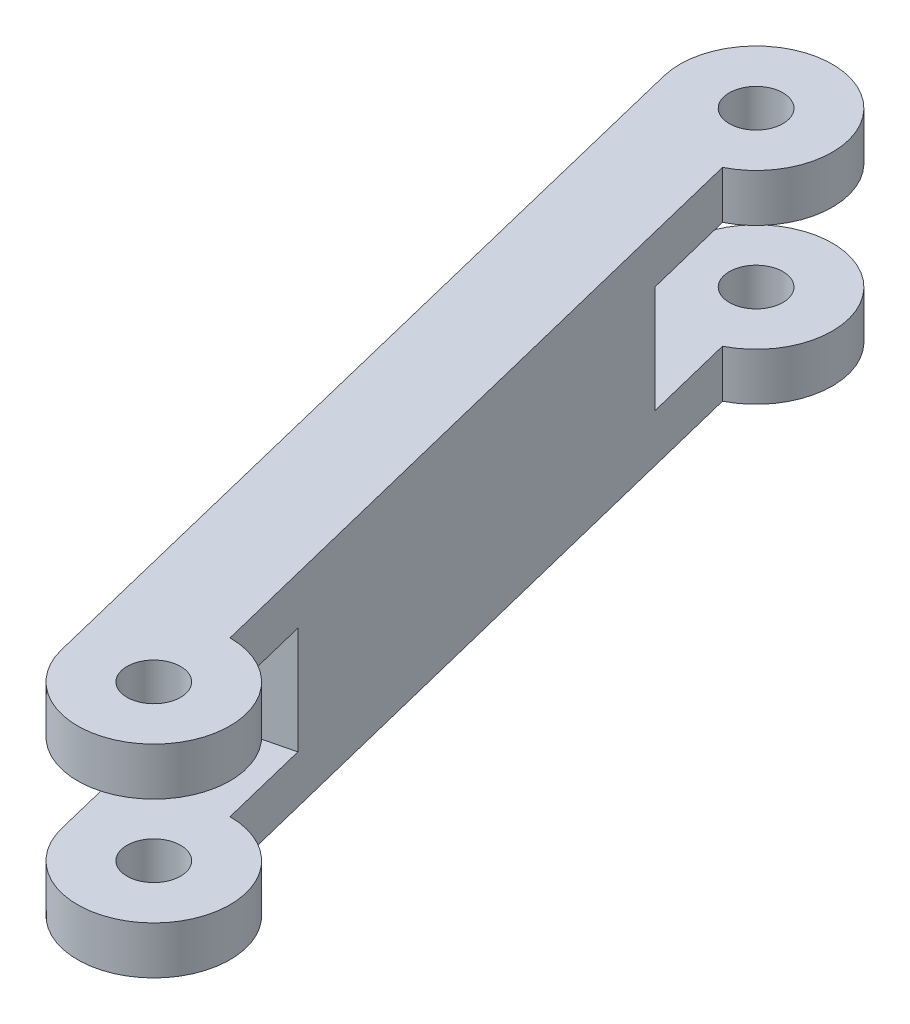
ISO-10303-21;
HEADER;
FILE_DESCRIPTION(('STEP AP214'),'2;1');
FILE_NAME('part.step','',(''),(''),'','','');
FILE_SCHEMA(('AUTOMOTIVE_DESIGN { 1 0 10303 214 1 1 1 1 }'));
ENDSEC;
DATA;
#1=APPLICATION_CONTEXT('core data for automotive mechanical design processes');
#2=APPLICATION_PROTOCOL_DEFINITION('international standard','automotive_design',2000,#1);
#3=PRODUCT_CONTEXT('',#1,'mechanical');
#4=PRODUCT('Part','Part','',(#3));
#5=PRODUCT_RELATED_PRODUCT_CATEGORY('part','',(#4));
#6=PRODUCT_DEFINITION_FORMATION('','',#4);
#7=PRODUCT_DEFINITION_CONTEXT('part definition',#1,'design');
#8=PRODUCT_DEFINITION('design','',#6,#7);
#9=PRODUCT_DEFINITION_SHAPE('','',#8);
#10=(LENGTH_UNIT() NAMED_UNIT(*) SI_UNIT(.MILLI.,.METRE.));
#11=(NAMED_UNIT(*) PLANE_ANGLE_UNIT() SI_UNIT($,.RADIAN.));
#12=(NAMED_UNIT(*) SI_UNIT($,.STERADIAN.) SOLID_ANGLE_UNIT());
#13=UNCERTAINTY_MEASURE_WITH_UNIT(LENGTH_MEASURE(1.E-05),#10,'distance_accuracy_value','');
#14=(GEOMETRIC_REPRESENTATION_CONTEXT(3) GLOBAL_UNCERTAINTY_ASSIGNED_CONTEXT((#13)) GLOBAL_UNIT_ASSIGNED_CONTEXT((#10,
#11,#12)) REPRESENTATION_CONTEXT('',''));
#15=CARTESIAN_POINT('',(0.,0.,0.));
#16=DIRECTION('',(0.,0.,1.));
#17=DIRECTION('',(1.,0.,0.));
#18=AXIS2_PLACEMENT_3D('',#15,#16,#17);
#19=CARTESIAN_POINT('',(-0.372682187268065,8.5,-3.2824835297537));
#20=DIRECTION('',(0.,-1.,0.));
#21=DIRECTION('',(0.,0.,-1.));
#22=AXIS2_PLACEMENT_3D('',#19,#20,#21);
#23=CYLINDRICAL_SURFACE('',#22,3.2);
#24=DIRECTION('',(0.,-1.,0.));
#25=VECTOR('',#24,1.);
#26=CARTESIAN_POINT('',(-3.4806210389002,8.5,-2.52043622510949));
#27=LINE('',#26,#25);
#28=CARTESIAN_POINT('',(-3.4806210389002,8.5,-2.52043622510949));
#29=VERTEX_POINT('',#28);
#30=CARTESIAN_POINT('',(-3.4806210389002,6.5,-2.52043622510948));
#31=VERTEX_POINT('',#30);
#32=EDGE_CURVE('E218',#29,#31,#27,.T.);
#33=ORIENTED_EDGE('',*,*,#32,.T.);
#34=CARTESIAN_POINT('',(-0.372682187268065,6.5,-3.2824835297537));
#35=DIRECTION('',(0.,1.,0.));
#36=DIRECTION('',(0.,0.,1.));
#37=AXIS2_PLACEMENT_3D('',#34,#35,#36);
#38=CIRCLE('',#37,3.2);
#39=CARTESIAN_POINT('',(-0.372682187268065,6.5,-6.4824835297537));
#40=VERTEX_POINT('',#39);
#41=EDGE_CURVE('E152',#31,#40,#38,.T.);
#42=ORIENTED_EDGE('',*,*,#41,.T.);
#43=DIRECTION('',(0.,-1.,0.));
#44=VECTOR('',#43,1.);
#45=CARTESIAN_POINT('',(-0.372682187268064,8.5,-6.4824835297537));
#46=LINE('',#45,#44);
#47=CARTESIAN_POINT('',(-0.372682187268064,8.5,-6.4824835297537));
#48=VERTEX_POINT('',#47);
#49=EDGE_CURVE('E215',#48,#40,#46,.T.);
#50=ORIENTED_EDGE('',*,*,#49,.F.);
#51=CARTESIAN_POINT('',(-0.372682187268065,8.5,-3.2824835297537));
#52=DIRECTION('',(0.,1.,0.));
#53=DIRECTION('',(0.,0.,1.));
#54=AXIS2_PLACEMENT_3D('',#51,#52,#53);
#55=CIRCLE('',#54,3.2);
#56=EDGE_CURVE('E197',#29,#48,#55,.T.);
#57=ORIENTED_EDGE('',*,*,#56,.F.);
#58=EDGE_LOOP('',(#33,#42,#50,#57));
#59=FACE_BOUND('',#58,.T.);
#60=ADVANCED_FACE('F32',(#59),#23,.T.);
#61=CARTESIAN_POINT('',(-0.372682187268065,8.5,-3.2824835297537));
#62=DIRECTION('',(0.,-1.,0.));
#63=DIRECTION('',(0.,0.,-1.));
#64=AXIS2_PLACEMENT_3D('',#61,#62,#63);
#65=CYLINDRICAL_SURFACE('',#64,1.125);
#66=CARTESIAN_POINT('',(-0.372682187268065,6.5,-3.2824835297537));
#67=DIRECTION('',(0.,1.,0.));
#68=DIRECTION('',(0.,0.,1.));
#69=AXIS2_PLACEMENT_3D('',#66,#67,#68);
#70=CIRCLE('',#69,1.125);
#71=CARTESIAN_POINT('',(-0.372682187268065,6.5,-2.1574835297537));
#72=VERTEX_POINT('',#71);
#73=EDGE_CURVE('E148',#72,#72,#70,.T.);
#74=ORIENTED_EDGE('',*,*,#73,.F.);
#75=EDGE_LOOP('',(#74));
#76=FACE_BOUND('',#75,.T.);
#77=CARTESIAN_POINT('',(-0.372682187268065,8.5,-3.2824835297537));
#78=DIRECTION('',(0.,1.,0.));
#79=DIRECTION('',(0.,0.,1.));
#80=AXIS2_PLACEMENT_3D('',#77,#78,#79);
#81=CIRCLE('',#80,1.125);
#82=CARTESIAN_POINT('',(-0.372682187268065,8.5,-2.1574835297537));
#83=VERTEX_POINT('',#82);
#84=EDGE_CURVE('E179',#83,#83,#81,.T.);
#85=ORIENTED_EDGE('',*,*,#84,.T.);
#86=EDGE_LOOP('',(#85));
#87=FACE_BOUND('',#86,.T.);
#88=ADVANCED_FACE('F238',(#76,#87),#65,.F.);
#89=CARTESIAN_POINT('',(-8.58443722829567,8.5,-36.7733605088558));
#90=DIRECTION('',(0.,-1.,0.));
#91=DIRECTION('',(0.,0.,-1.));
#92=AXIS2_PLACEMENT_3D('',#89,#90,#91);
#93=CYLINDRICAL_SURFACE('',#92,3.2);
#94=DIRECTION('',(0.,-1.,0.));
#95=VECTOR('',#94,1.);
#96=CARTESIAN_POINT('',(-11.6923760799278,8.5,-36.0113132042116));
#97=LINE('',#96,#95);
#98=CARTESIAN_POINT('',(-11.6923760799278,2.,-36.0113132042116));
#99=VERTEX_POINT('',#98);
#100=CARTESIAN_POINT('',(-11.6923760799278,0.,-36.0113132042116));
#101=VERTEX_POINT('',#100);
#102=EDGE_CURVE('E221',#99,#101,#97,.T.);
#103=ORIENTED_EDGE('',*,*,#102,.F.);
#104=CARTESIAN_POINT('',(-8.58443722829567,2.,-36.7733605088558));
#105=DIRECTION('',(0.,-1.,0.));
#106=DIRECTION('',(0.,0.,-1.));
#107=AXIS2_PLACEMENT_3D('',#104,#105,#106);
#108=CIRCLE('',#107,3.2);
#109=CARTESIAN_POINT('',(-7.14020433681748,2.,-33.9178060346472));
#110=VERTEX_POINT('',#109);
#111=EDGE_CURVE('E175',#99,#110,#108,.T.);
#112=ORIENTED_EDGE('',*,*,#111,.T.);
#113=DIRECTION('',(0.,-1.,0.));
#114=VECTOR('',#113,1.);
#115=CARTESIAN_POINT('',(-7.14020433681748,8.5,-33.9178060346472));
#116=LINE('',#115,#114);
#117=CARTESIAN_POINT('',(-7.14020433681748,0.,-33.9178060346472));
#118=VERTEX_POINT('',#117);
#119=EDGE_CURVE('E201',#110,#118,#116,.T.);
#120=ORIENTED_EDGE('',*,*,#119,.T.);
#121=CARTESIAN_POINT('',(-8.58443722829567,0.,-36.7733605088558));
#122=DIRECTION('',(0.,1.,0.));
#123=DIRECTION('',(0.,0.,1.));
#124=AXIS2_PLACEMENT_3D('',#121,#122,#123);
#125=CIRCLE('',#124,3.2);
#126=EDGE_CURVE('E188',#118,#101,#125,.T.);
#127=ORIENTED_EDGE('',*,*,#126,.T.);
#128=EDGE_LOOP('',(#103,#112,#120,#127));
#129=FACE_BOUND('',#128,.T.);
#130=ADVANCED_FACE('F241',(#129),#93,.T.);
#131=CARTESIAN_POINT('',(-8.58443722829567,8.5,-36.7733605088558));
#132=DIRECTION('',(0.,-1.,0.));
#133=DIRECTION('',(0.,0.,-1.));
#134=AXIS2_PLACEMENT_3D('',#131,#132,#133);
#135=CYLINDRICAL_SURFACE('',#134,1.125);
#136=CARTESIAN_POINT('',(-8.58443722829567,2.,-36.7733605088558));
#137=DIRECTION('',(0.,-1.,0.));
#138=DIRECTION('',(0.,0.,-1.));
#139=AXIS2_PLACEMENT_3D('',#136,#137,#138);
#140=CIRCLE('',#139,1.125);
#141=CARTESIAN_POINT('',(-8.58443722829567,2.,-37.8983605088558));
#142=VERTEX_POINT('',#141);
#143=EDGE_CURVE('E171',#142,#142,#140,.T.);
#144=ORIENTED_EDGE('',*,*,#143,.F.);
#145=EDGE_LOOP('',(#144));
#146=FACE_BOUND('',#145,.T.);
#147=CARTESIAN_POINT('',(-8.58443722829567,0.,-36.7733605088558));
#148=DIRECTION('',(0.,1.,0.));
#149=DIRECTION('',(0.,0.,1.));
#150=AXIS2_PLACEMENT_3D('',#147,#148,#149);
#151=CIRCLE('',#150,1.125);
#152=CARTESIAN_POINT('',(-8.58443722829567,0.,-35.6483605088558));
#153=VERTEX_POINT('',#152);
#154=EDGE_CURVE('E182',#153,#153,#151,.T.);
#155=ORIENTED_EDGE('',*,*,#154,.F.);
#156=EDGE_LOOP('',(#155));
#157=FACE_BOUND('',#156,.T.);
#158=ADVANCED_FACE('F249',(#146,#157),#135,.F.);
#159=CARTESIAN_POINT('',(-8.58443722829567,8.5,-36.7733605088558));
#160=DIRECTION('',(0.,1.,0.));
#161=DIRECTION('',(0.,0.,1.));
#162=AXIS2_PLACEMENT_3D('',#159,#160,#161);
#163=PLANE('',#162);
#164=CARTESIAN_POINT('',(-8.58443722829567,8.5,-36.7733605088558));
#165=DIRECTION('',(0.,1.,0.));
#166=DIRECTION('',(0.,0.,1.));
#167=AXIS2_PLACEMENT_3D('',#164,#165,#166);
#168=CIRCLE('',#167,1.125);
#169=CARTESIAN_POINT('',(-8.58443722829567,8.5,-35.6483605088558));
#170=VERTEX_POINT('',#169);
#171=EDGE_CURVE('E185',#170,#170,#168,.T.);
#172=ORIENTED_EDGE('',*,*,#171,.F.);
#173=EDGE_LOOP('',(#172));
#174=FACE_BOUND('',#173,.T.);
#175=CARTESIAN_POINT('',(-8.58443722829567,8.5,-36.7733605088558));
#176=DIRECTION('',(0.,1.,0.));
#177=DIRECTION('',(0.,0.,1.));
#178=AXIS2_PLACEMENT_3D('',#175,#176,#177);
#179=CIRCLE('',#178,3.2);
#180=CARTESIAN_POINT('',(-7.14020433681748,8.5,-33.9178060346472));
#181=VERTEX_POINT('',#180);
#182=CARTESIAN_POINT('',(-11.6923760799278,8.5,-36.0113132042116));
#183=VERTEX_POINT('',#182);
#184=EDGE_CURVE('E191',#181,#183,#179,.T.);
#185=ORIENTED_EDGE('',*,*,#184,.T.);
#186=DIRECTION('',(0.238139782701317,0.,0.971230891135043));
#187=VECTOR('',#186,1.);
#188=CARTESIAN_POINT('',(-11.6923760799278,8.5,-36.0113132042116));
#189=LINE('',#188,#187);
#190=EDGE_CURVE('E194',#183,#29,#189,.T.);
#191=ORIENTED_EDGE('',*,*,#190,.T.);
#192=ORIENTED_EDGE('',*,*,#56,.T.);
#193=DIRECTION('',(-0.239493228230933,0.,-0.970898034621312));
#194=VECTOR('',#193,1.);
#195=CARTESIAN_POINT('',(-7.14020433681748,8.5,-33.9178060346472));
#196=LINE('',#195,#194);
#197=EDGE_CURVE('E199',#48,#181,#196,.T.);
#198=ORIENTED_EDGE('',*,*,#197,.T.);
#199=EDGE_LOOP('',(#185,#191,#192,#198));
#200=FACE_BOUND('',#199,.T.);
#201=ORIENTED_EDGE('',*,*,#84,.F.);
#202=EDGE_LOOP('',(#201));
#203=FACE_BOUND('',#202,.T.);
#204=ADVANCED_FACE('F246',(#174,#200,#203),#163,.T.);
#205=CARTESIAN_POINT('',(-8.58443722829567,0.,-36.7733605088558));
#206=DIRECTION('',(0.,1.,0.));
#207=DIRECTION('',(0.,0.,1.));
#208=AXIS2_PLACEMENT_3D('',#205,#206,#207);
#209=PLANE('',#208);
#210=ORIENTED_EDGE('',*,*,#126,.F.);
#211=DIRECTION('',(-0.239493228230933,0.,-0.970898034621312));
#212=VECTOR('',#211,1.);
#213=CARTESIAN_POINT('',(-7.14020433681748,0.,-33.9178060346472));
#214=LINE('',#213,#212);
#215=CARTESIAN_POINT('',(-0.372682187268064,0.,-6.4824835297537));
#216=VERTEX_POINT('',#215);
#217=EDGE_CURVE('E195',#216,#118,#214,.T.);
#218=ORIENTED_EDGE('',*,*,#217,.F.);
#219=CARTESIAN_POINT('',(-0.372682187268065,0.,-3.2824835297537));
#220=DIRECTION('',(0.,1.,0.));
#221=DIRECTION('',(0.,0.,1.));
#222=AXIS2_PLACEMENT_3D('',#219,#220,#221);
#223=CIRCLE('',#222,3.2);
#224=CARTESIAN_POINT('',(-3.4806210389002,0.,-2.52043622510949));
#225=VERTEX_POINT('',#224);
#226=EDGE_CURVE('E206',#225,#216,#223,.T.);
#227=ORIENTED_EDGE('',*,*,#226,.F.);
#228=DIRECTION('',(0.238139782701317,0.,0.971230891135043));
#229=VECTOR('',#228,1.);
#230=CARTESIAN_POINT('',(-11.6923760799278,0.,-36.0113132042116));
#231=LINE('',#230,#229);
#232=EDGE_CURVE('E204',#101,#225,#231,.T.);
#233=ORIENTED_EDGE('',*,*,#232,.F.);
#234=EDGE_LOOP('',(#210,#218,#227,#233));
#235=FACE_BOUND('',#234,.T.);
#236=ORIENTED_EDGE('',*,*,#154,.T.);
#237=EDGE_LOOP('',(#236));
#238=FACE_BOUND('',#237,.T.);
#239=CARTESIAN_POINT('',(-0.372682187268065,0.,-3.2824835297537));
#240=DIRECTION('',(0.,1.,0.));
#241=DIRECTION('',(0.,0.,1.));
#242=AXIS2_PLACEMENT_3D('',#239,#240,#241);
#243=CIRCLE('',#242,1.125);
#244=CARTESIAN_POINT('',(-0.372682187268065,0.,-2.1574835297537));
#245=VERTEX_POINT('',#244);
#246=EDGE_CURVE('E178',#245,#245,#243,.T.);
#247=ORIENTED_EDGE('',*,*,#246,.T.);
#248=EDGE_LOOP('',(#247));
#249=FACE_BOUND('',#248,.T.);
#250=ADVANCED_FACE('F248',(#235,#238,#249),#209,.F.);
#251=CARTESIAN_POINT('',(-7.14020433681748,6.5,-33.9178060346472));
#252=VERTEX_POINT('',#251);
#253=EDGE_CURVE('E211',#181,#252,#116,.T.);
#254=ORIENTED_EDGE('',*,*,#253,.T.);
#255=CARTESIAN_POINT('',(-8.58443722829567,6.5,-36.7733605088558));
#256=DIRECTION('',(0.,1.,0.));
#257=DIRECTION('',(0.,0.,1.));
#258=AXIS2_PLACEMENT_3D('',#255,#256,#257);
#259=CIRCLE('',#258,3.2);
#260=CARTESIAN_POINT('',(-11.6923760799278,6.5,-36.0113132042116));
#261=VERTEX_POINT('',#260);
#262=EDGE_CURVE('E55',#252,#261,#259,.T.);
#263=ORIENTED_EDGE('',*,*,#262,.T.);
#264=EDGE_CURVE('E222',#183,#261,#97,.T.);
#265=ORIENTED_EDGE('',*,*,#264,.F.);
#266=ORIENTED_EDGE('',*,*,#184,.F.);
#267=EDGE_LOOP('',(#254,#263,#265,#266));
#268=FACE_BOUND('',#267,.T.);
#269=ADVANCED_FACE('F34',(#268),#93,.T.);
#270=CARTESIAN_POINT('',(-11.6923760799278,8.5,-36.0113132042116));
#271=DIRECTION('',(0.971230891135043,0.,-0.238139782701317));
#272=DIRECTION('',(-0.238139782701317,0.,-0.971230891135043));
#273=AXIS2_PLACEMENT_3D('',#270,#271,#272);
#274=PLANE('',#273);
#275=DIRECTION('',(0.,-1.,0.));
#276=VECTOR('',#275,1.);
#277=CARTESIAN_POINT('',(-5.14759951780942,6.5,-9.31905246305479));
#278=LINE('',#277,#276);
#279=CARTESIAN_POINT('',(-5.14759951780942,6.5,-9.31905246305479));
#280=VERTEX_POINT('',#279);
#281=CARTESIAN_POINT('',(-5.14759951780942,2.,-9.31905246305479));
#282=VERTEX_POINT('',#281);
#283=EDGE_CURVE('E130',#280,#282,#278,.T.);
#284=ORIENTED_EDGE('',*,*,#283,.F.);
#285=DIRECTION('',(-0.238139782701317,0.,-0.971230891135043));
#286=VECTOR('',#285,1.);
#287=CARTESIAN_POINT('',(-5.14759951780942,6.5,-9.31905246305479));
#288=LINE('',#287,#286);
#289=EDGE_CURVE('E127',#31,#280,#288,.T.);
#290=ORIENTED_EDGE('',*,*,#289,.F.);
#291=ORIENTED_EDGE('',*,*,#32,.F.);
#292=ORIENTED_EDGE('',*,*,#190,.F.);
#293=ORIENTED_EDGE('',*,*,#264,.T.);
#294=DIRECTION('',(-0.238139782701317,0.,-0.971230891135043));
#295=VECTOR('',#294,1.);
#296=CARTESIAN_POINT('',(-10.0253976010186,6.5,-29.2126969662663));
#297=LINE('',#296,#295);
#298=CARTESIAN_POINT('',(-10.0253976010186,6.5,-29.2126969662663));
#299=VERTEX_POINT('',#298);
#300=EDGE_CURVE('E158',#299,#261,#297,.T.);
#301=ORIENTED_EDGE('',*,*,#300,.F.);
#302=DIRECTION('',(0.,1.,0.));
#303=VECTOR('',#302,1.);
#304=CARTESIAN_POINT('',(-10.0253976010186,6.5,-29.2126969662663));
#305=LINE('',#304,#303);
#306=CARTESIAN_POINT('',(-10.0253976010186,2.,-29.2126969662663));
#307=VERTEX_POINT('',#306);
#308=EDGE_CURVE('E155',#307,#299,#305,.T.);
#309=ORIENTED_EDGE('',*,*,#308,.F.);
#310=DIRECTION('',(0.238139782701317,0.,0.971230891135043));
#311=VECTOR('',#310,1.);
#312=CARTESIAN_POINT('',(-10.0253976010186,2.,-29.2126969662663));
#313=LINE('',#312,#311);
#314=EDGE_CURVE('E160',#99,#307,#313,.T.);
#315=ORIENTED_EDGE('',*,*,#314,.F.);
#316=ORIENTED_EDGE('',*,*,#102,.T.);
#317=ORIENTED_EDGE('',*,*,#232,.T.);
#318=CARTESIAN_POINT('',(-3.4806210389002,2.,-2.52043622510948));
#319=VERTEX_POINT('',#318);
#320=EDGE_CURVE('E140',#319,#225,#27,.T.);
#321=ORIENTED_EDGE('',*,*,#320,.F.);
#322=DIRECTION('',(0.238139782701317,0.,0.971230891135043));
#323=VECTOR('',#322,1.);
#324=CARTESIAN_POINT('',(-5.14759951780942,2.,-9.31905246305479));
#325=LINE('',#324,#323);
#326=EDGE_CURVE('E123',#282,#319,#325,.T.);
#327=ORIENTED_EDGE('',*,*,#326,.F.);
#328=EDGE_LOOP('',(#284,#290,#291,#292,#293,#301,#309,#315,#316,#317,#321,#327));
#329=FACE_BOUND('',#328,.T.);
#330=ADVANCED_FACE('F138',(#329),#274,.F.);
#331=CARTESIAN_POINT('',(-0.372682187268064,2.,-6.4824835297537));
#332=VERTEX_POINT('',#331);
#333=EDGE_CURVE('E214',#332,#216,#46,.T.);
#334=ORIENTED_EDGE('',*,*,#333,.F.);
#335=CARTESIAN_POINT('',(-0.372682187268065,2.,-3.2824835297537));
#336=DIRECTION('',(0.,-1.,0.));
#337=DIRECTION('',(0.,0.,-1.));
#338=AXIS2_PLACEMENT_3D('',#335,#336,#337);
#339=CIRCLE('',#338,3.2);
#340=EDGE_CURVE('E47',#332,#319,#339,.T.);
#341=ORIENTED_EDGE('',*,*,#340,.T.);
#342=ORIENTED_EDGE('',*,*,#320,.T.);
#343=ORIENTED_EDGE('',*,*,#226,.T.);
#344=EDGE_LOOP('',(#334,#341,#342,#343));
#345=FACE_BOUND('',#344,.T.);
#346=ADVANCED_FACE('F266',(#345),#23,.T.);
#347=CARTESIAN_POINT('',(-7.14020433681748,8.5,-33.9178060346472));
#348=DIRECTION('',(-0.970898034621312,0.,0.239493228230933));
#349=DIRECTION('',(0.239493228230933,0.,0.970898034621312));
#350=AXIS2_PLACEMENT_3D('',#347,#348,#349);
#351=PLANE('',#350);
#352=ORIENTED_EDGE('',*,*,#49,.T.);
#353=DIRECTION('',(-0.239493228230933,0.,-0.970898034621312));
#354=VECTOR('',#353,1.);
#355=CARTESIAN_POINT('',(-7.14020433681748,6.5,-33.9178060346472));
#356=LINE('',#355,#354);
#357=CARTESIAN_POINT('',(-1.30480538153799,6.5,-10.2612817196923));
#358=VERTEX_POINT('',#357);
#359=EDGE_CURVE('E149',#40,#358,#356,.T.);
#360=ORIENTED_EDGE('',*,*,#359,.T.);
#361=DIRECTION('',(0.,-1.,0.));
#362=VECTOR('',#361,1.);
#363=CARTESIAN_POINT('',(-1.30480538153799,8.5,-10.2612817196923));
#364=LINE('',#363,#362);
#365=CARTESIAN_POINT('',(-1.30480538153799,2.,-10.2612817196923));
#366=VERTEX_POINT('',#365);
#367=EDGE_CURVE('E11',#358,#366,#364,.T.);
#368=ORIENTED_EDGE('',*,*,#367,.T.);
#369=DIRECTION('',(0.239493228230933,0.,0.970898034621312));
#370=VECTOR('',#369,1.);
#371=CARTESIAN_POINT('',(-7.14020433681748,2.,-33.9178060346472));
#372=LINE('',#371,#370);
#373=EDGE_CURVE('E124',#366,#332,#372,.T.);
#374=ORIENTED_EDGE('',*,*,#373,.T.);
#375=ORIENTED_EDGE('',*,*,#333,.T.);
#376=ORIENTED_EDGE('',*,*,#217,.T.);
#377=ORIENTED_EDGE('',*,*,#119,.F.);
#378=DIRECTION('',(0.239493228230933,0.,0.970898034621312));
#379=VECTOR('',#378,1.);
#380=CARTESIAN_POINT('',(-7.14020433681748,2.,-33.9178060346472));
#381=LINE('',#380,#379);
#382=CARTESIAN_POINT('',(-6.21033074581458,2.,-30.1481276657857));
#383=VERTEX_POINT('',#382);
#384=EDGE_CURVE('E172',#110,#383,#381,.T.);
#385=ORIENTED_EDGE('',*,*,#384,.T.);
#386=DIRECTION('',(0.,1.,0.));
#387=VECTOR('',#386,1.);
#388=CARTESIAN_POINT('',(-6.21033074581458,8.5,-30.1481276657857));
#389=LINE('',#388,#387);
#390=CARTESIAN_POINT('',(-6.21033074581458,6.5,-30.1481276657857));
#391=VERTEX_POINT('',#390);
#392=EDGE_CURVE('E40',#383,#391,#389,.T.);
#393=ORIENTED_EDGE('',*,*,#392,.T.);
#394=DIRECTION('',(-0.239493228230933,0.,-0.970898034621312));
#395=VECTOR('',#394,1.);
#396=CARTESIAN_POINT('',(-7.14020433681748,6.5,-33.9178060346472));
#397=LINE('',#396,#395);
#398=EDGE_CURVE('E168',#391,#252,#397,.T.);
#399=ORIENTED_EDGE('',*,*,#398,.T.);
#400=ORIENTED_EDGE('',*,*,#253,.F.);
#401=ORIENTED_EDGE('',*,*,#197,.F.);
#402=EDGE_LOOP('',(#352,#360,#368,#374,#375,#376,#377,#385,#393,#399,#400,#401));
#403=FACE_BOUND('',#402,.T.);
#404=ADVANCED_FACE('F271',(#403),#351,.F.);
#405=CARTESIAN_POINT('',(-8.58443722829567,6.5,-36.7733605088558));
#406=DIRECTION('',(0.,1.,0.));
#407=DIRECTION('',(0.,0.,1.));
#408=AXIS2_PLACEMENT_3D('',#405,#406,#407);
#409=CIRCLE('',#408,1.125);
#410=CARTESIAN_POINT('',(-8.58443722829567,6.5,-35.6483605088558));
#411=VERTEX_POINT('',#410);
#412=EDGE_CURVE('E166',#411,#411,#409,.T.);
#413=ORIENTED_EDGE('',*,*,#412,.F.);
#414=EDGE_LOOP('',(#413));
#415=FACE_BOUND('',#414,.T.);
#416=ORIENTED_EDGE('',*,*,#171,.T.);
#417=EDGE_LOOP('',(#416));
#418=FACE_BOUND('',#417,.T.);
#419=ADVANCED_FACE('F260',(#415,#418),#135,.F.);
#420=CARTESIAN_POINT('',(-0.372682187268065,2.,-3.2824835297537));
#421=DIRECTION('',(0.,-1.,0.));
#422=DIRECTION('',(0.,0.,-1.));
#423=AXIS2_PLACEMENT_3D('',#420,#421,#422);
#424=CIRCLE('',#423,1.125);
#425=CARTESIAN_POINT('',(-0.372682187268065,2.,-4.4074835297537));
#426=VERTEX_POINT('',#425);
#427=EDGE_CURVE('E144',#426,#426,#424,.T.);
#428=ORIENTED_EDGE('',*,*,#427,.F.);
#429=EDGE_LOOP('',(#428));
#430=FACE_BOUND('',#429,.T.);
#431=ORIENTED_EDGE('',*,*,#246,.F.);
#432=EDGE_LOOP('',(#431));
#433=FACE_BOUND('',#432,.T.);
#434=ADVANCED_FACE('F243',(#430,#433),#65,.F.);
#435=CARTESIAN_POINT('',(-1.76993502637072,6.5,-31.2368851192275));
#436=DIRECTION('',(0.238139782701317,0.,0.971230891135043));
#437=DIRECTION('',(0.971230891135043,0.,-0.238139782701317));
#438=AXIS2_PLACEMENT_3D('',#435,#436,#437);
#439=PLANE('',#438);
#440=DIRECTION('',(-0.971230891135043,0.,0.238139782701317));
#441=VECTOR('',#440,1.);
#442=CARTESIAN_POINT('',(-1.76993502637072,2.,-31.2368851192275));
#443=LINE('',#442,#441);
#444=EDGE_CURVE('E164',#383,#307,#443,.T.);
#445=ORIENTED_EDGE('',*,*,#444,.T.);
#446=ORIENTED_EDGE('',*,*,#308,.T.);
#447=DIRECTION('',(-0.971230891135043,0.,0.238139782701317));
#448=VECTOR('',#447,1.);
#449=CARTESIAN_POINT('',(-1.76993502637072,6.5,-31.2368851192275));
#450=LINE('',#449,#448);
#451=EDGE_CURVE('E163',#391,#299,#450,.T.);
#452=ORIENTED_EDGE('',*,*,#451,.F.);
#453=ORIENTED_EDGE('',*,*,#392,.F.);
#454=EDGE_LOOP('',(#445,#446,#452,#453));
#455=FACE_BOUND('',#454,.T.);
#456=ADVANCED_FACE('F296',(#455),#439,.F.);
#457=CARTESIAN_POINT('',(-1.76993502637072,2.,-31.2368851192275));
#458=DIRECTION('',(0.,-1.,0.));
#459=DIRECTION('',(0.,0.,-1.));
#460=AXIS2_PLACEMENT_3D('',#457,#458,#459);
#461=PLANE('',#460);
#462=ORIENTED_EDGE('',*,*,#143,.T.);
#463=EDGE_LOOP('',(#462));
#464=FACE_BOUND('',#463,.T.);
#465=ORIENTED_EDGE('',*,*,#314,.T.);
#466=ORIENTED_EDGE('',*,*,#444,.F.);
#467=ORIENTED_EDGE('',*,*,#384,.F.);
#468=ORIENTED_EDGE('',*,*,#111,.F.);
#469=EDGE_LOOP('',(#465,#466,#467,#468));
#470=FACE_BOUND('',#469,.T.);
#471=ADVANCED_FACE('F314',(#464,#470),#461,.F.);
#472=CARTESIAN_POINT('',(-1.76993502637072,6.5,-31.2368851192275));
#473=DIRECTION('',(0.,1.,0.));
#474=DIRECTION('',(0.,0.,1.));
#475=AXIS2_PLACEMENT_3D('',#472,#473,#474);
#476=PLANE('',#475);
#477=ORIENTED_EDGE('',*,*,#412,.T.);
#478=EDGE_LOOP('',(#477));
#479=FACE_BOUND('',#478,.T.);
#480=ORIENTED_EDGE('',*,*,#398,.F.);
#481=ORIENTED_EDGE('',*,*,#451,.T.);
#482=ORIENTED_EDGE('',*,*,#300,.T.);
#483=ORIENTED_EDGE('',*,*,#262,.F.);
#484=EDGE_LOOP('',(#480,#481,#482,#483));
#485=FACE_BOUND('',#484,.T.);
#486=ADVANCED_FACE('F294',(#479,#485),#476,.F.);
#487=CARTESIAN_POINT('',(3.10786305683844,6.5,-11.343240616016));
#488=DIRECTION('',(-0.238139782701317,0.,-0.971230891135043));
#489=DIRECTION('',(-0.971230891135043,0.,0.238139782701317));
#490=AXIS2_PLACEMENT_3D('',#487,#488,#489);
#491=PLANE('',#490);
#492=DIRECTION('',(-0.971230891135043,0.,0.238139782701317));
#493=VECTOR('',#492,1.);
#494=CARTESIAN_POINT('',(3.10786305683844,6.5,-11.343240616016));
#495=LINE('',#494,#493);
#496=EDGE_CURVE('E126',#358,#280,#495,.T.);
#497=ORIENTED_EDGE('',*,*,#496,.T.);
#498=ORIENTED_EDGE('',*,*,#283,.T.);
#499=DIRECTION('',(-0.971230891135043,0.,0.238139782701317));
#500=VECTOR('',#499,1.);
#501=CARTESIAN_POINT('',(3.10786305683844,2.,-11.343240616016));
#502=LINE('',#501,#500);
#503=EDGE_CURVE('E119',#366,#282,#502,.T.);
#504=ORIENTED_EDGE('',*,*,#503,.F.);
#505=ORIENTED_EDGE('',*,*,#367,.F.);
#506=EDGE_LOOP('',(#497,#498,#504,#505));
#507=FACE_BOUND('',#506,.T.);
#508=ADVANCED_FACE('F131',(#507),#491,.F.);
#509=CARTESIAN_POINT('',(3.10786305683844,6.5,-11.343240616016));
#510=DIRECTION('',(0.,1.,0.));
#511=DIRECTION('',(0.,0.,1.));
#512=AXIS2_PLACEMENT_3D('',#509,#510,#511);
#513=PLANE('',#512);
#514=ORIENTED_EDGE('',*,*,#73,.T.);
#515=EDGE_LOOP('',(#514));
#516=FACE_BOUND('',#515,.T.);
#517=ORIENTED_EDGE('',*,*,#289,.T.);
#518=ORIENTED_EDGE('',*,*,#496,.F.);
#519=ORIENTED_EDGE('',*,*,#359,.F.);
#520=ORIENTED_EDGE('',*,*,#41,.F.);
#521=EDGE_LOOP('',(#517,#518,#519,#520));
#522=FACE_BOUND('',#521,.T.);
#523=ADVANCED_FACE('F235',(#516,#522),#513,.F.);
#524=CARTESIAN_POINT('',(3.10786305683844,2.,-11.343240616016));
#525=DIRECTION('',(0.,-1.,0.));
#526=DIRECTION('',(0.,0.,-1.));
#527=AXIS2_PLACEMENT_3D('',#524,#525,#526);
#528=PLANE('',#527);
#529=ORIENTED_EDGE('',*,*,#427,.T.);
#530=EDGE_LOOP('',(#529));
#531=FACE_BOUND('',#530,.T.);
#532=ORIENTED_EDGE('',*,*,#373,.F.);
#533=ORIENTED_EDGE('',*,*,#503,.T.);
#534=ORIENTED_EDGE('',*,*,#326,.T.);
#535=ORIENTED_EDGE('',*,*,#340,.F.);
#536=EDGE_LOOP('',(#532,#533,#534,#535));
#537=FACE_BOUND('',#536,.T.);
#538=ADVANCED_FACE('F121',(#531,#537),#528,.F.);
#539=CLOSED_SHELL('',(#60,#88,#130,#158,#204,#250,#269,#330,#346,#404,#419,#434,#456,#471,#486,
#508,#523,#538));
#540=MANIFOLD_SOLID_BREP('B2',#539);
#541=ADVANCED_BREP_SHAPE_REPRESENTATION('',(#18,#540),#14);
#542=SHAPE_DEFINITION_REPRESENTATION(#9,#541);
ENDSEC;
END-ISO-10303-21;
